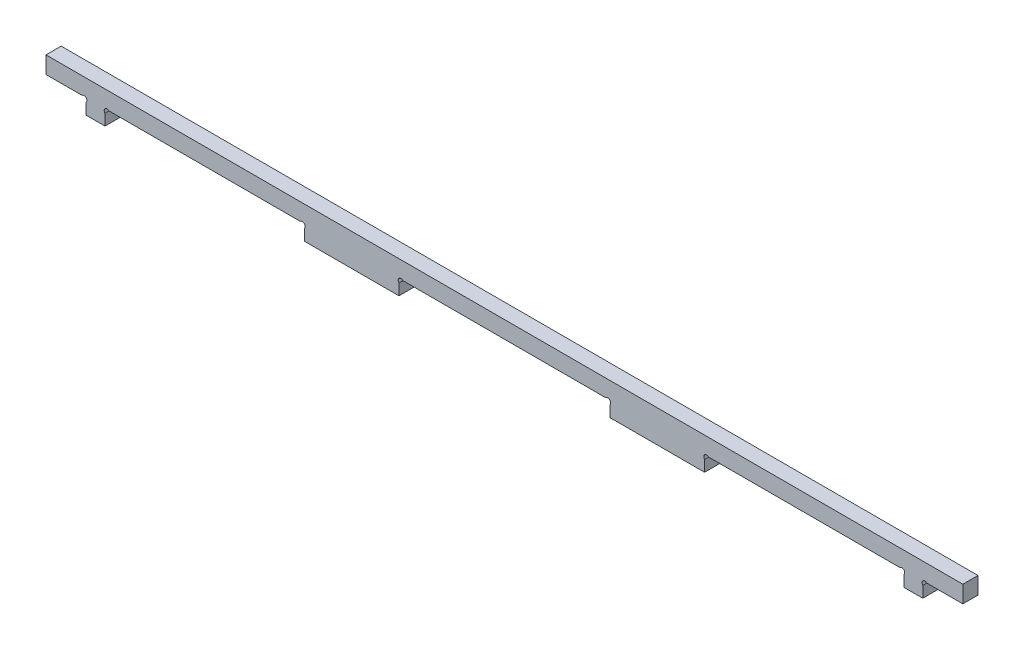
ISO-10303-21;
HEADER;
FILE_DESCRIPTION(('STEP AP214'),'2;1');
FILE_NAME('part.step','',(''),(''),'','','');
FILE_SCHEMA(('AUTOMOTIVE_DESIGN { 1 0 10303 214 1 1 1 1 }'));
ENDSEC;
DATA;
#1=APPLICATION_CONTEXT('core data for automotive mechanical design processes');
#2=APPLICATION_PROTOCOL_DEFINITION('international standard','automotive_design',2000,#1);
#3=PRODUCT_CONTEXT('',#1,'mechanical');
#4=PRODUCT('Part','Part','',(#3));
#5=PRODUCT_RELATED_PRODUCT_CATEGORY('part','',(#4));
#6=PRODUCT_DEFINITION_FORMATION('','',#4);
#7=PRODUCT_DEFINITION_CONTEXT('part definition',#1,'design');
#8=PRODUCT_DEFINITION('design','',#6,#7);
#9=PRODUCT_DEFINITION_SHAPE('','',#8);
#10=(LENGTH_UNIT() NAMED_UNIT(*) SI_UNIT(.MILLI.,.METRE.));
#11=(NAMED_UNIT(*) PLANE_ANGLE_UNIT() SI_UNIT($,.RADIAN.));
#12=(NAMED_UNIT(*) SI_UNIT($,.STERADIAN.) SOLID_ANGLE_UNIT());
#13=UNCERTAINTY_MEASURE_WITH_UNIT(LENGTH_MEASURE(1.E-05),#10,'distance_accuracy_value','');
#14=(GEOMETRIC_REPRESENTATION_CONTEXT(3) GLOBAL_UNCERTAINTY_ASSIGNED_CONTEXT((#13)) GLOBAL_UNIT_ASSIGNED_CONTEXT((#10,
#11,#12)) REPRESENTATION_CONTEXT('',''));
#15=CARTESIAN_POINT('',(0.,0.,0.));
#16=DIRECTION('',(0.,0.,1.));
#17=DIRECTION('',(1.,0.,0.));
#18=AXIS2_PLACEMENT_3D('',#15,#16,#17);
#19=CARTESIAN_POINT('',(-233.999999999997,77.5822204720186,8.));
#20=DIRECTION('',(1.,0.,0.));
#21=DIRECTION('',(0.,0.,-1.));
#22=AXIS2_PLACEMENT_3D('',#19,#20,#21);
#23=PLANE('',#22);
#24=DIRECTION('',(0.,-1.,0.));
#25=VECTOR('',#24,1.);
#26=CARTESIAN_POINT('',(-233.999999999997,77.5822204720186,0.));
#27=LINE('',#26,#25);
#28=CARTESIAN_POINT('',(-233.999999999997,77.5822204720186,0.));
#29=VERTEX_POINT('',#28);
#30=CARTESIAN_POINT('',(-233.999999999997,68.5822204720186,0.));
#31=VERTEX_POINT('',#30);
#32=EDGE_CURVE('E248',#29,#31,#27,.T.);
#33=ORIENTED_EDGE('',*,*,#32,.T.);
#34=DIRECTION('',(0.,0.,-1.));
#35=VECTOR('',#34,1.);
#36=CARTESIAN_POINT('',(-233.999999999997,68.5822204720186,8.));
#37=LINE('',#36,#35);
#38=CARTESIAN_POINT('',(-233.999999999997,68.5822204720186,8.));
#39=VERTEX_POINT('',#38);
#40=EDGE_CURVE('E11',#39,#31,#37,.T.);
#41=ORIENTED_EDGE('',*,*,#40,.F.);
#42=DIRECTION('',(0.,-1.,0.));
#43=VECTOR('',#42,1.);
#44=CARTESIAN_POINT('',(-233.999999999997,77.5822204720186,8.));
#45=LINE('',#44,#43);
#46=CARTESIAN_POINT('',(-233.999999999997,77.5822204720186,8.));
#47=VERTEX_POINT('',#46);
#48=EDGE_CURVE('E302',#47,#39,#45,.T.);
#49=ORIENTED_EDGE('',*,*,#48,.F.);
#50=DIRECTION('',(0.,0.,-1.));
#51=VECTOR('',#50,1.);
#52=CARTESIAN_POINT('',(-233.999999999997,77.5822204720186,8.));
#53=LINE('',#52,#51);
#54=EDGE_CURVE('E244',#47,#29,#53,.T.);
#55=ORIENTED_EDGE('',*,*,#54,.T.);
#56=EDGE_LOOP('',(#33,#41,#49,#55));
#57=FACE_BOUND('',#56,.T.);
#58=ADVANCED_FACE('F32',(#57),#23,.F.);
#59=CARTESIAN_POINT('',(-233.999999999997,68.5822204720186,8.));
#60=DIRECTION('',(0.,1.,0.));
#61=DIRECTION('',(-1.,0.,0.));
#62=AXIS2_PLACEMENT_3D('',#59,#60,#61);
#63=PLANE('',#62);
#64=DIRECTION('',(1.,0.,0.));
#65=VECTOR('',#64,1.);
#66=CARTESIAN_POINT('',(-233.999999999997,68.5822204720186,0.));
#67=LINE('',#66,#65);
#68=CARTESIAN_POINT('',(-214.972064577997,68.5822204720186,0.));
#69=VERTEX_POINT('',#68);
#70=EDGE_CURVE('E251',#31,#69,#67,.T.);
#71=ORIENTED_EDGE('',*,*,#70,.T.);
#72=DIRECTION('',(0.,0.,-1.));
#73=VECTOR('',#72,1.);
#74=CARTESIAN_POINT('',(-214.972064577997,68.5822204720186,8.));
#75=LINE('',#74,#73);
#76=CARTESIAN_POINT('',(-214.972064577997,68.5822204720186,8.));
#77=VERTEX_POINT('',#76);
#78=EDGE_CURVE('E40',#77,#69,#75,.T.);
#79=ORIENTED_EDGE('',*,*,#78,.F.);
#80=DIRECTION('',(1.,0.,0.));
#81=VECTOR('',#80,1.);
#82=CARTESIAN_POINT('',(-233.999999999997,68.5822204720186,8.));
#83=LINE('',#82,#81);
#84=EDGE_CURVE('E151',#39,#77,#83,.T.);
#85=ORIENTED_EDGE('',*,*,#84,.F.);
#86=ORIENTED_EDGE('',*,*,#40,.T.);
#87=EDGE_LOOP('',(#71,#79,#85,#86));
#88=FACE_BOUND('',#87,.T.);
#89=ADVANCED_FACE('F460',(#88),#63,.F.);
#90=CARTESIAN_POINT('',(-213.911404406218,67.5215603002388,8.));
#91=DIRECTION('',(0.,0.,-1.));
#92=DIRECTION('',(-1.,0.,0.));
#93=AXIS2_PLACEMENT_3D('',#90,#91,#92);
#94=CYLINDRICAL_SURFACE('',#93,1.5);
#95=CARTESIAN_POINT('',(-213.911404406218,67.5215603002388,0.));
#96=DIRECTION('',(0.,0.,-1.));
#97=DIRECTION('',(1.,0.,0.));
#98=AXIS2_PLACEMENT_3D('',#95,#96,#97);
#99=CIRCLE('',#98,1.5);
#100=CARTESIAN_POINT('',(-212.850744234438,66.460900128459,0.));
#101=VERTEX_POINT('',#100);
#102=EDGE_CURVE('E253',#69,#101,#99,.T.);
#103=ORIENTED_EDGE('',*,*,#102,.T.);
#104=DIRECTION('',(0.,0.,-1.));
#105=VECTOR('',#104,1.);
#106=CARTESIAN_POINT('',(-212.850744234438,66.460900128459,8.));
#107=LINE('',#106,#105);
#108=CARTESIAN_POINT('',(-212.850744234438,66.460900128459,8.));
#109=VERTEX_POINT('',#108);
#110=EDGE_CURVE('E369',#109,#101,#107,.T.);
#111=ORIENTED_EDGE('',*,*,#110,.F.);
#112=CARTESIAN_POINT('',(-213.911404406218,67.5215603002388,8.));
#113=DIRECTION('',(0.,0.,-1.));
#114=DIRECTION('',(1.,0.,0.));
#115=AXIS2_PLACEMENT_3D('',#112,#113,#114);
#116=CIRCLE('',#115,1.5);
#117=EDGE_CURVE('E377',#77,#109,#116,.T.);
#118=ORIENTED_EDGE('',*,*,#117,.F.);
#119=ORIENTED_EDGE('',*,*,#78,.T.);
#120=EDGE_LOOP('',(#103,#111,#118,#119));
#121=FACE_BOUND('',#120,.T.);
#122=ADVANCED_FACE('F375',(#121),#94,.F.);
#123=CARTESIAN_POINT('',(-212.850744234438,66.460900128459,8.));
#124=DIRECTION('',(1.,0.,0.));
#125=DIRECTION('',(0.,1.,0.));
#126=AXIS2_PLACEMENT_3D('',#123,#124,#125);
#127=PLANE('',#126);
#128=DIRECTION('',(0.,-1.,0.));
#129=VECTOR('',#128,1.);
#130=CARTESIAN_POINT('',(-212.850744234438,66.460900128459,0.));
#131=LINE('',#130,#129);
#132=CARTESIAN_POINT('',(-212.850744234438,60.5822204720186,0.));
#133=VERTEX_POINT('',#132);
#134=EDGE_CURVE('E255',#101,#133,#131,.T.);
#135=ORIENTED_EDGE('',*,*,#134,.T.);
#136=DIRECTION('',(0.,0.,-1.));
#137=VECTOR('',#136,1.);
#138=CARTESIAN_POINT('',(-212.850744234438,60.5822204720186,8.));
#139=LINE('',#138,#137);
#140=CARTESIAN_POINT('',(-212.850744234438,60.5822204720186,8.));
#141=VERTEX_POINT('',#140);
#142=EDGE_CURVE('E366',#141,#133,#139,.T.);
#143=ORIENTED_EDGE('',*,*,#142,.F.);
#144=DIRECTION('',(0.,-1.,0.));
#145=VECTOR('',#144,1.);
#146=CARTESIAN_POINT('',(-212.850744234438,66.460900128459,8.));
#147=LINE('',#146,#145);
#148=EDGE_CURVE('E395',#109,#141,#147,.T.);
#149=ORIENTED_EDGE('',*,*,#148,.F.);
#150=ORIENTED_EDGE('',*,*,#110,.T.);
#151=EDGE_LOOP('',(#135,#143,#149,#150));
#152=FACE_BOUND('',#151,.T.);
#153=ADVANCED_FACE('F386',(#152),#127,.F.);
#154=CARTESIAN_POINT('',(-212.850744234438,60.5822204720186,8.));
#155=DIRECTION('',(0.,1.,0.));
#156=DIRECTION('',(0.,0.,1.));
#157=AXIS2_PLACEMENT_3D('',#154,#155,#156);
#158=PLANE('',#157);
#159=DIRECTION('',(1.,0.,0.));
#160=VECTOR('',#159,1.);
#161=CARTESIAN_POINT('',(-212.850744234438,60.5822204720186,0.));
#162=LINE('',#161,#160);
#163=CARTESIAN_POINT('',(-202.850744234438,60.5822204720186,0.));
#164=VERTEX_POINT('',#163);
#165=EDGE_CURVE('E257',#133,#164,#162,.T.);
#166=ORIENTED_EDGE('',*,*,#165,.T.);
#167=DIRECTION('',(0.,0.,-1.));
#168=VECTOR('',#167,1.);
#169=CARTESIAN_POINT('',(-202.850744234438,60.5822204720186,8.));
#170=LINE('',#169,#168);
#171=CARTESIAN_POINT('',(-202.850744234438,60.5822204720186,8.));
#172=VERTEX_POINT('',#171);
#173=EDGE_CURVE('E363',#172,#164,#170,.T.);
#174=ORIENTED_EDGE('',*,*,#173,.F.);
#175=DIRECTION('',(1.,0.,0.));
#176=VECTOR('',#175,1.);
#177=CARTESIAN_POINT('',(-212.850744234438,60.5822204720186,8.));
#178=LINE('',#177,#176);
#179=EDGE_CURVE('E392',#141,#172,#178,.T.);
#180=ORIENTED_EDGE('',*,*,#179,.F.);
#181=ORIENTED_EDGE('',*,*,#142,.T.);
#182=EDGE_LOOP('',(#166,#174,#180,#181));
#183=FACE_BOUND('',#182,.T.);
#184=ADVANCED_FACE('F390',(#183),#158,.F.);
#185=CARTESIAN_POINT('',(-202.850744234438,60.5822204720186,8.));
#186=DIRECTION('',(-1.,0.,0.));
#187=DIRECTION('',(0.,-1.,0.));
#188=AXIS2_PLACEMENT_3D('',#185,#186,#187);
#189=PLANE('',#188);
#190=DIRECTION('',(0.,1.,0.));
#191=VECTOR('',#190,1.);
#192=CARTESIAN_POINT('',(-202.850744234438,60.5822204720186,0.));
#193=LINE('',#192,#191);
#194=CARTESIAN_POINT('',(-202.850744234438,66.460900128459,0.));
#195=VERTEX_POINT('',#194);
#196=EDGE_CURVE('E259',#164,#195,#193,.T.);
#197=ORIENTED_EDGE('',*,*,#196,.T.);
#198=DIRECTION('',(0.,0.,-1.));
#199=VECTOR('',#198,1.);
#200=CARTESIAN_POINT('',(-202.850744234438,66.460900128459,8.));
#201=LINE('',#200,#199);
#202=CARTESIAN_POINT('',(-202.850744234438,66.460900128459,8.));
#203=VERTEX_POINT('',#202);
#204=EDGE_CURVE('E360',#203,#195,#201,.T.);
#205=ORIENTED_EDGE('',*,*,#204,.F.);
#206=DIRECTION('',(0.,1.,0.));
#207=VECTOR('',#206,1.);
#208=CARTESIAN_POINT('',(-202.850744234438,60.5822204720186,8.));
#209=LINE('',#208,#207);
#210=EDGE_CURVE('E394',#172,#203,#209,.T.);
#211=ORIENTED_EDGE('',*,*,#210,.F.);
#212=ORIENTED_EDGE('',*,*,#173,.T.);
#213=EDGE_LOOP('',(#197,#205,#211,#212));
#214=FACE_BOUND('',#213,.T.);
#215=ADVANCED_FACE('F473',(#214),#189,.F.);
#216=CARTESIAN_POINT('',(-201.790084062658,67.5215603002388,8.));
#217=DIRECTION('',(0.,0.,-1.));
#218=DIRECTION('',(-1.,0.,0.));
#219=AXIS2_PLACEMENT_3D('',#216,#217,#218);
#220=CYLINDRICAL_SURFACE('',#219,1.5);
#221=CARTESIAN_POINT('',(-201.790084062658,67.5215603002388,0.));
#222=DIRECTION('',(0.,0.,-1.));
#223=DIRECTION('',(1.,0.,0.));
#224=AXIS2_PLACEMENT_3D('',#221,#222,#223);
#225=CIRCLE('',#224,1.5);
#226=CARTESIAN_POINT('',(-200.729423890878,68.5822204720186,0.));
#227=VERTEX_POINT('',#226);
#228=EDGE_CURVE('E261',#195,#227,#225,.T.);
#229=ORIENTED_EDGE('',*,*,#228,.T.);
#230=DIRECTION('',(0.,0.,-1.));
#231=VECTOR('',#230,1.);
#232=CARTESIAN_POINT('',(-200.729423890878,68.5822204720186,8.));
#233=LINE('',#232,#231);
#234=CARTESIAN_POINT('',(-200.729423890878,68.5822204720186,8.));
#235=VERTEX_POINT('',#234);
#236=EDGE_CURVE('E357',#235,#227,#233,.T.);
#237=ORIENTED_EDGE('',*,*,#236,.F.);
#238=CARTESIAN_POINT('',(-201.790084062658,67.5215603002388,8.));
#239=DIRECTION('',(0.,0.,-1.));
#240=DIRECTION('',(1.,0.,0.));
#241=AXIS2_PLACEMENT_3D('',#238,#239,#240);
#242=CIRCLE('',#241,1.5);
#243=EDGE_CURVE('E397',#203,#235,#242,.T.);
#244=ORIENTED_EDGE('',*,*,#243,.F.);
#245=ORIENTED_EDGE('',*,*,#204,.T.);
#246=EDGE_LOOP('',(#229,#237,#244,#245));
#247=FACE_BOUND('',#246,.T.);
#248=ADVANCED_FACE('F476',(#247),#220,.F.);
#249=CARTESIAN_POINT('',(-200.729423890878,68.5822204720186,8.));
#250=DIRECTION('',(0.,1.,0.));
#251=DIRECTION('',(0.,0.,1.));
#252=AXIS2_PLACEMENT_3D('',#249,#250,#251);
#253=PLANE('',#252);
#254=DIRECTION('',(1.,0.,0.));
#255=VECTOR('',#254,1.);
#256=CARTESIAN_POINT('',(-200.729423890878,68.5822204720186,0.));
#257=LINE('',#256,#255);
#258=CARTESIAN_POINT('',(-99.7875172457823,68.5822204720186,0.));
#259=VERTEX_POINT('',#258);
#260=EDGE_CURVE('E263',#227,#259,#257,.T.);
#261=ORIENTED_EDGE('',*,*,#260,.T.);
#262=DIRECTION('',(0.,0.,-1.));
#263=VECTOR('',#262,1.);
#264=CARTESIAN_POINT('',(-99.7875172457823,68.5822204720186,8.));
#265=LINE('',#264,#263);
#266=CARTESIAN_POINT('',(-99.7875172457823,68.5822204720186,8.));
#267=VERTEX_POINT('',#266);
#268=EDGE_CURVE('E354',#267,#259,#265,.T.);
#269=ORIENTED_EDGE('',*,*,#268,.F.);
#270=DIRECTION('',(1.,0.,0.));
#271=VECTOR('',#270,1.);
#272=CARTESIAN_POINT('',(-200.729423890878,68.5822204720186,8.));
#273=LINE('',#272,#271);
#274=EDGE_CURVE('E403',#235,#267,#273,.T.);
#275=ORIENTED_EDGE('',*,*,#274,.F.);
#276=ORIENTED_EDGE('',*,*,#236,.T.);
#277=EDGE_LOOP('',(#261,#269,#275,#276));
#278=FACE_BOUND('',#277,.T.);
#279=ADVANCED_FACE('F480',(#278),#253,.F.);
#280=CARTESIAN_POINT('',(-98.7268570740025,67.5215603002388,8.));
#281=DIRECTION('',(0.,0.,-1.));
#282=DIRECTION('',(-1.,0.,0.));
#283=AXIS2_PLACEMENT_3D('',#280,#281,#282);
#284=CYLINDRICAL_SURFACE('',#283,1.49999999999996);
#285=CARTESIAN_POINT('',(-98.7268570740025,67.5215603002388,0.));
#286=DIRECTION('',(0.,0.,-1.));
#287=DIRECTION('',(1.,0.,0.));
#288=AXIS2_PLACEMENT_3D('',#285,#286,#287);
#289=CIRCLE('',#288,1.49999999999996);
#290=CARTESIAN_POINT('',(-97.6661969022227,66.460900128459,0.));
#291=VERTEX_POINT('',#290);
#292=EDGE_CURVE('E265',#259,#291,#289,.T.);
#293=ORIENTED_EDGE('',*,*,#292,.T.);
#294=DIRECTION('',(0.,0.,-1.));
#295=VECTOR('',#294,1.);
#296=CARTESIAN_POINT('',(-97.6661969022227,66.460900128459,8.));
#297=LINE('',#296,#295);
#298=CARTESIAN_POINT('',(-97.6661969022227,66.460900128459,8.));
#299=VERTEX_POINT('',#298);
#300=EDGE_CURVE('E351',#299,#291,#297,.T.);
#301=ORIENTED_EDGE('',*,*,#300,.F.);
#302=CARTESIAN_POINT('',(-98.7268570740025,67.5215603002388,8.));
#303=DIRECTION('',(0.,0.,-1.));
#304=DIRECTION('',(1.,0.,0.));
#305=AXIS2_PLACEMENT_3D('',#302,#303,#304);
#306=CIRCLE('',#305,1.49999999999996);
#307=EDGE_CURVE('E405',#267,#299,#306,.T.);
#308=ORIENTED_EDGE('',*,*,#307,.F.);
#309=ORIENTED_EDGE('',*,*,#268,.T.);
#310=EDGE_LOOP('',(#293,#301,#308,#309));
#311=FACE_BOUND('',#310,.T.);
#312=ADVANCED_FACE('F484',(#311),#284,.F.);
#313=CARTESIAN_POINT('',(-97.6661969022227,66.460900128459,8.));
#314=DIRECTION('',(1.,0.,0.));
#315=DIRECTION('',(0.,0.,-1.));
#316=AXIS2_PLACEMENT_3D('',#313,#314,#315);
#317=PLANE('',#316);
#318=DIRECTION('',(0.,-1.,0.));
#319=VECTOR('',#318,1.);
#320=CARTESIAN_POINT('',(-97.6661969022227,66.460900128459,0.));
#321=LINE('',#320,#319);
#322=CARTESIAN_POINT('',(-97.6661969022227,60.5822204720186,0.));
#323=VERTEX_POINT('',#322);
#324=EDGE_CURVE('E267',#291,#323,#321,.T.);
#325=ORIENTED_EDGE('',*,*,#324,.T.);
#326=DIRECTION('',(0.,0.,-1.));
#327=VECTOR('',#326,1.);
#328=CARTESIAN_POINT('',(-97.6661969022227,60.5822204720186,8.));
#329=LINE('',#328,#327);
#330=CARTESIAN_POINT('',(-97.6661969022227,60.5822204720186,8.));
#331=VERTEX_POINT('',#330);
#332=EDGE_CURVE('E348',#331,#323,#329,.T.);
#333=ORIENTED_EDGE('',*,*,#332,.F.);
#334=DIRECTION('',(0.,-1.,0.));
#335=VECTOR('',#334,1.);
#336=CARTESIAN_POINT('',(-97.6661969022227,66.460900128459,8.));
#337=LINE('',#336,#335);
#338=EDGE_CURVE('E407',#299,#331,#337,.T.);
#339=ORIENTED_EDGE('',*,*,#338,.F.);
#340=ORIENTED_EDGE('',*,*,#300,.T.);
#341=EDGE_LOOP('',(#325,#333,#339,#340));
#342=FACE_BOUND('',#341,.T.);
#343=ADVANCED_FACE('F488',(#342),#317,.F.);
#344=CARTESIAN_POINT('',(-97.6661969022227,60.5822204720186,8.));
#345=DIRECTION('',(0.,1.,0.));
#346=DIRECTION('',(0.,0.,1.));
#347=AXIS2_PLACEMENT_3D('',#344,#345,#346);
#348=PLANE('',#347);
#349=DIRECTION('',(1.,0.,0.));
#350=VECTOR('',#349,1.);
#351=CARTESIAN_POINT('',(-97.6661969022227,60.5822204720186,0.));
#352=LINE('',#351,#350);
#353=CARTESIAN_POINT('',(-47.6661969022227,60.5822204720186,0.));
#354=VERTEX_POINT('',#353);
#355=EDGE_CURVE('E269',#323,#354,#352,.T.);
#356=ORIENTED_EDGE('',*,*,#355,.T.);
#357=DIRECTION('',(0.,0.,-1.));
#358=VECTOR('',#357,1.);
#359=CARTESIAN_POINT('',(-47.6661969022227,60.5822204720186,8.));
#360=LINE('',#359,#358);
#361=CARTESIAN_POINT('',(-47.6661969022227,60.5822204720186,8.));
#362=VERTEX_POINT('',#361);
#363=EDGE_CURVE('E345',#362,#354,#360,.T.);
#364=ORIENTED_EDGE('',*,*,#363,.F.);
#365=DIRECTION('',(1.,0.,0.));
#366=VECTOR('',#365,1.);
#367=CARTESIAN_POINT('',(-97.6661969022227,60.5822204720186,8.));
#368=LINE('',#367,#366);
#369=EDGE_CURVE('E409',#331,#362,#368,.T.);
#370=ORIENTED_EDGE('',*,*,#369,.F.);
#371=ORIENTED_EDGE('',*,*,#332,.T.);
#372=EDGE_LOOP('',(#356,#364,#370,#371));
#373=FACE_BOUND('',#372,.T.);
#374=ADVANCED_FACE('F492',(#373),#348,.F.);
#375=CARTESIAN_POINT('',(-47.6661969022227,60.5822204720186,8.));
#376=DIRECTION('',(-1.,0.,0.));
#377=DIRECTION('',(0.,0.,1.));
#378=AXIS2_PLACEMENT_3D('',#375,#376,#377);
#379=PLANE('',#378);
#380=DIRECTION('',(0.,1.,0.));
#381=VECTOR('',#380,1.);
#382=CARTESIAN_POINT('',(-47.6661969022227,60.5822204720186,0.));
#383=LINE('',#382,#381);
#384=CARTESIAN_POINT('',(-47.6661969022227,66.460900128459,0.));
#385=VERTEX_POINT('',#384);
#386=EDGE_CURVE('E271',#354,#385,#383,.T.);
#387=ORIENTED_EDGE('',*,*,#386,.T.);
#388=DIRECTION('',(0.,0.,-1.));
#389=VECTOR('',#388,1.);
#390=CARTESIAN_POINT('',(-47.6661969022227,66.460900128459,8.));
#391=LINE('',#390,#389);
#392=CARTESIAN_POINT('',(-47.6661969022227,66.460900128459,8.));
#393=VERTEX_POINT('',#392);
#394=EDGE_CURVE('E342',#393,#385,#391,.T.);
#395=ORIENTED_EDGE('',*,*,#394,.F.);
#396=DIRECTION('',(0.,1.,0.));
#397=VECTOR('',#396,1.);
#398=CARTESIAN_POINT('',(-47.6661969022227,60.5822204720186,8.));
#399=LINE('',#398,#397);
#400=EDGE_CURVE('E411',#362,#393,#399,.T.);
#401=ORIENTED_EDGE('',*,*,#400,.F.);
#402=ORIENTED_EDGE('',*,*,#363,.T.);
#403=EDGE_LOOP('',(#387,#395,#401,#402));
#404=FACE_BOUND('',#403,.T.);
#405=ADVANCED_FACE('F496',(#404),#379,.F.);
#406=CARTESIAN_POINT('',(-46.6055367304429,67.5215603002388,8.));
#407=DIRECTION('',(0.,0.,-1.));
#408=DIRECTION('',(-1.,0.,0.));
#409=AXIS2_PLACEMENT_3D('',#406,#407,#408);
#410=CYLINDRICAL_SURFACE('',#409,1.5);
#411=CARTESIAN_POINT('',(-46.6055367304429,67.5215603002388,0.));
#412=DIRECTION('',(0.,0.,-1.));
#413=DIRECTION('',(1.,0.,0.));
#414=AXIS2_PLACEMENT_3D('',#411,#412,#413);
#415=CIRCLE('',#414,1.5);
#416=CARTESIAN_POINT('',(-45.544876558663,68.5822204720186,0.));
#417=VERTEX_POINT('',#416);
#418=EDGE_CURVE('E273',#385,#417,#415,.T.);
#419=ORIENTED_EDGE('',*,*,#418,.T.);
#420=DIRECTION('',(0.,0.,-1.));
#421=VECTOR('',#420,1.);
#422=CARTESIAN_POINT('',(-45.544876558663,68.5822204720186,8.));
#423=LINE('',#422,#421);
#424=CARTESIAN_POINT('',(-45.544876558663,68.5822204720186,8.));
#425=VERTEX_POINT('',#424);
#426=EDGE_CURVE('E339',#425,#417,#423,.T.);
#427=ORIENTED_EDGE('',*,*,#426,.F.);
#428=CARTESIAN_POINT('',(-46.6055367304429,67.5215603002388,8.));
#429=DIRECTION('',(0.,0.,-1.));
#430=DIRECTION('',(1.,0.,0.));
#431=AXIS2_PLACEMENT_3D('',#428,#429,#430);
#432=CIRCLE('',#431,1.5);
#433=EDGE_CURVE('E413',#393,#425,#432,.T.);
#434=ORIENTED_EDGE('',*,*,#433,.F.);
#435=ORIENTED_EDGE('',*,*,#394,.T.);
#436=EDGE_LOOP('',(#419,#427,#434,#435));
#437=FACE_BOUND('',#436,.T.);
#438=ADVANCED_FACE('F500',(#437),#410,.F.);
#439=CARTESIAN_POINT('',(-45.544876558663,68.5822204720186,8.));
#440=DIRECTION('',(0.,1.,0.));
#441=DIRECTION('',(0.,0.,1.));
#442=AXIS2_PLACEMENT_3D('',#439,#440,#441);
#443=PLANE('',#442);
#444=DIRECTION('',(1.,0.,0.));
#445=VECTOR('',#444,1.);
#446=CARTESIAN_POINT('',(-45.544876558663,68.5822204720186,0.));
#447=LINE('',#446,#445);
#448=CARTESIAN_POINT('',(61.5448765586698,68.5822204720186,0.));
#449=VERTEX_POINT('',#448);
#450=EDGE_CURVE('E275',#417,#449,#447,.T.);
#451=ORIENTED_EDGE('',*,*,#450,.T.);
#452=DIRECTION('',(0.,0.,-1.));
#453=VECTOR('',#452,1.);
#454=CARTESIAN_POINT('',(61.5448765586698,68.5822204720186,8.));
#455=LINE('',#454,#453);
#456=CARTESIAN_POINT('',(61.5448765586698,68.5822204720186,8.));
#457=VERTEX_POINT('',#456);
#458=EDGE_CURVE('E336',#457,#449,#455,.T.);
#459=ORIENTED_EDGE('',*,*,#458,.F.);
#460=DIRECTION('',(1.,0.,0.));
#461=VECTOR('',#460,1.);
#462=CARTESIAN_POINT('',(-45.544876558663,68.5822204720186,8.));
#463=LINE('',#462,#461);
#464=EDGE_CURVE('E415',#425,#457,#463,.T.);
#465=ORIENTED_EDGE('',*,*,#464,.F.);
#466=ORIENTED_EDGE('',*,*,#426,.T.);
#467=EDGE_LOOP('',(#451,#459,#465,#466));
#468=FACE_BOUND('',#467,.T.);
#469=ADVANCED_FACE('F504',(#468),#443,.F.);
#470=CARTESIAN_POINT('',(62.6055367304497,67.5215603002388,8.));
#471=DIRECTION('',(0.,0.,-1.));
#472=DIRECTION('',(-1.,0.,0.));
#473=AXIS2_PLACEMENT_3D('',#470,#471,#472);
#474=CYLINDRICAL_SURFACE('',#473,1.5);
#475=CARTESIAN_POINT('',(62.6055367304497,67.5215603002388,0.));
#476=DIRECTION('',(0.,0.,-1.));
#477=DIRECTION('',(-1.,0.,0.));
#478=AXIS2_PLACEMENT_3D('',#475,#476,#477);
#479=CIRCLE('',#478,1.5);
#480=CARTESIAN_POINT('',(63.6661969022295,66.460900128459,0.));
#481=VERTEX_POINT('',#480);
#482=EDGE_CURVE('E277',#449,#481,#479,.T.);
#483=ORIENTED_EDGE('',*,*,#482,.T.);
#484=DIRECTION('',(0.,0.,-1.));
#485=VECTOR('',#484,1.);
#486=CARTESIAN_POINT('',(63.6661969022295,66.460900128459,8.));
#487=LINE('',#486,#485);
#488=CARTESIAN_POINT('',(63.6661969022295,66.460900128459,8.));
#489=VERTEX_POINT('',#488);
#490=EDGE_CURVE('E333',#489,#481,#487,.T.);
#491=ORIENTED_EDGE('',*,*,#490,.F.);
#492=CARTESIAN_POINT('',(62.6055367304497,67.5215603002388,8.));
#493=DIRECTION('',(0.,0.,-1.));
#494=DIRECTION('',(-1.,0.,0.));
#495=AXIS2_PLACEMENT_3D('',#492,#493,#494);
#496=CIRCLE('',#495,1.5);
#497=EDGE_CURVE('E417',#457,#489,#496,.T.);
#498=ORIENTED_EDGE('',*,*,#497,.F.);
#499=ORIENTED_EDGE('',*,*,#458,.T.);
#500=EDGE_LOOP('',(#483,#491,#498,#499));
#501=FACE_BOUND('',#500,.T.);
#502=ADVANCED_FACE('F508',(#501),#474,.F.);
#503=CARTESIAN_POINT('',(63.6661969022296,60.5822204720186,8.));
#504=DIRECTION('',(1.,0.,0.));
#505=DIRECTION('',(0.,1.,0.));
#506=AXIS2_PLACEMENT_3D('',#503,#504,#505);
#507=PLANE('',#506);
#508=DIRECTION('',(0.,-1.,0.));
#509=VECTOR('',#508,1.);
#510=CARTESIAN_POINT('',(63.6661969022296,60.5822204720186,0.));
#511=LINE('',#510,#509);
#512=CARTESIAN_POINT('',(63.6661969022296,60.5822204720186,0.));
#513=VERTEX_POINT('',#512);
#514=EDGE_CURVE('E279',#481,#513,#511,.T.);
#515=ORIENTED_EDGE('',*,*,#514,.T.);
#516=DIRECTION('',(0.,0.,-1.));
#517=VECTOR('',#516,1.);
#518=CARTESIAN_POINT('',(63.6661969022296,60.5822204720186,8.));
#519=LINE('',#518,#517);
#520=CARTESIAN_POINT('',(63.6661969022296,60.5822204720186,8.));
#521=VERTEX_POINT('',#520);
#522=EDGE_CURVE('E330',#521,#513,#519,.T.);
#523=ORIENTED_EDGE('',*,*,#522,.F.);
#524=DIRECTION('',(0.,-1.,0.));
#525=VECTOR('',#524,1.);
#526=CARTESIAN_POINT('',(63.6661969022296,60.5822204720186,8.));
#527=LINE('',#526,#525);
#528=EDGE_CURVE('E419',#489,#521,#527,.T.);
#529=ORIENTED_EDGE('',*,*,#528,.F.);
#530=ORIENTED_EDGE('',*,*,#490,.T.);
#531=EDGE_LOOP('',(#515,#523,#529,#530));
#532=FACE_BOUND('',#531,.T.);
#533=ADVANCED_FACE('F512',(#532),#507,.F.);
#534=CARTESIAN_POINT('',(113.66619690223,60.5822204720186,8.));
#535=DIRECTION('',(0.,1.,0.));
#536=DIRECTION('',(0.,0.,1.));
#537=AXIS2_PLACEMENT_3D('',#534,#535,#536);
#538=PLANE('',#537);
#539=DIRECTION('',(1.,0.,0.));
#540=VECTOR('',#539,1.);
#541=CARTESIAN_POINT('',(113.66619690223,60.5822204720186,0.));
#542=LINE('',#541,#540);
#543=CARTESIAN_POINT('',(113.66619690223,60.5822204720186,0.));
#544=VERTEX_POINT('',#543);
#545=EDGE_CURVE('E281',#513,#544,#542,.T.);
#546=ORIENTED_EDGE('',*,*,#545,.T.);
#547=DIRECTION('',(0.,0.,-1.));
#548=VECTOR('',#547,1.);
#549=CARTESIAN_POINT('',(113.66619690223,60.5822204720186,8.));
#550=LINE('',#549,#548);
#551=CARTESIAN_POINT('',(113.66619690223,60.5822204720186,8.));
#552=VERTEX_POINT('',#551);
#553=EDGE_CURVE('E327',#552,#544,#550,.T.);
#554=ORIENTED_EDGE('',*,*,#553,.F.);
#555=DIRECTION('',(1.,0.,0.));
#556=VECTOR('',#555,1.);
#557=CARTESIAN_POINT('',(113.66619690223,60.5822204720186,8.));
#558=LINE('',#557,#556);
#559=EDGE_CURVE('E421',#521,#552,#558,.T.);
#560=ORIENTED_EDGE('',*,*,#559,.F.);
#561=ORIENTED_EDGE('',*,*,#522,.T.);
#562=EDGE_LOOP('',(#546,#554,#560,#561));
#563=FACE_BOUND('',#562,.T.);
#564=ADVANCED_FACE('F516',(#563),#538,.F.);
#565=CARTESIAN_POINT('',(113.666196902229,66.460900128459,8.));
#566=DIRECTION('',(-1.,0.,0.));
#567=DIRECTION('',(0.,-1.,0.));
#568=AXIS2_PLACEMENT_3D('',#565,#566,#567);
#569=PLANE('',#568);
#570=DIRECTION('',(0.,1.,0.));
#571=VECTOR('',#570,1.);
#572=CARTESIAN_POINT('',(113.666196902229,66.460900128459,0.));
#573=LINE('',#572,#571);
#574=CARTESIAN_POINT('',(113.666196902229,66.460900128459,0.));
#575=VERTEX_POINT('',#574);
#576=EDGE_CURVE('E283',#544,#575,#573,.T.);
#577=ORIENTED_EDGE('',*,*,#576,.T.);
#578=DIRECTION('',(0.,0.,-1.));
#579=VECTOR('',#578,1.);
#580=CARTESIAN_POINT('',(113.666196902229,66.460900128459,8.));
#581=LINE('',#580,#579);
#582=CARTESIAN_POINT('',(113.666196902229,66.460900128459,8.));
#583=VERTEX_POINT('',#582);
#584=EDGE_CURVE('E324',#583,#575,#581,.T.);
#585=ORIENTED_EDGE('',*,*,#584,.F.);
#586=DIRECTION('',(0.,1.,0.));
#587=VECTOR('',#586,1.);
#588=CARTESIAN_POINT('',(113.666196902229,66.460900128459,8.));
#589=LINE('',#588,#587);
#590=EDGE_CURVE('E423',#552,#583,#589,.T.);
#591=ORIENTED_EDGE('',*,*,#590,.F.);
#592=ORIENTED_EDGE('',*,*,#553,.T.);
#593=EDGE_LOOP('',(#577,#585,#591,#592));
#594=FACE_BOUND('',#593,.T.);
#595=ADVANCED_FACE('F520',(#594),#569,.F.);
#596=CARTESIAN_POINT('',(114.726857074009,67.5215603002388,8.));
#597=DIRECTION('',(0.,0.,-1.));
#598=DIRECTION('',(-1.,0.,0.));
#599=AXIS2_PLACEMENT_3D('',#596,#597,#598);
#600=CYLINDRICAL_SURFACE('',#599,1.49999999999996);
#601=CARTESIAN_POINT('',(114.726857074009,67.5215603002388,0.));
#602=DIRECTION('',(0.,0.,-1.));
#603=DIRECTION('',(-1.,0.,0.));
#604=AXIS2_PLACEMENT_3D('',#601,#602,#603);
#605=CIRCLE('',#604,1.49999999999996);
#606=CARTESIAN_POINT('',(115.787517245789,68.5822204720186,0.));
#607=VERTEX_POINT('',#606);
#608=EDGE_CURVE('E285',#575,#607,#605,.T.);
#609=ORIENTED_EDGE('',*,*,#608,.T.);
#610=DIRECTION('',(0.,0.,-1.));
#611=VECTOR('',#610,1.);
#612=CARTESIAN_POINT('',(115.787517245789,68.5822204720186,8.));
#613=LINE('',#612,#611);
#614=CARTESIAN_POINT('',(115.787517245789,68.5822204720186,8.));
#615=VERTEX_POINT('',#614);
#616=EDGE_CURVE('E321',#615,#607,#613,.T.);
#617=ORIENTED_EDGE('',*,*,#616,.F.);
#618=CARTESIAN_POINT('',(114.726857074009,67.5215603002388,8.));
#619=DIRECTION('',(0.,0.,-1.));
#620=DIRECTION('',(-1.,0.,0.));
#621=AXIS2_PLACEMENT_3D('',#618,#619,#620);
#622=CIRCLE('',#621,1.49999999999996);
#623=EDGE_CURVE('E425',#583,#615,#622,.T.);
#624=ORIENTED_EDGE('',*,*,#623,.F.);
#625=ORIENTED_EDGE('',*,*,#584,.T.);
#626=EDGE_LOOP('',(#609,#617,#624,#625));
#627=FACE_BOUND('',#626,.T.);
#628=ADVANCED_FACE('F524',(#627),#600,.F.);
#629=CARTESIAN_POINT('',(115.787517245789,68.5822204720186,8.));
#630=DIRECTION('',(0.,1.,0.));
#631=DIRECTION('',(0.,0.,1.));
#632=AXIS2_PLACEMENT_3D('',#629,#630,#631);
#633=PLANE('',#632);
#634=DIRECTION('',(1.,0.,0.));
#635=VECTOR('',#634,1.);
#636=CARTESIAN_POINT('',(115.787517245789,68.5822204720186,0.));
#637=LINE('',#636,#635);
#638=CARTESIAN_POINT('',(216.729423890885,68.5822204720186,0.));
#639=VERTEX_POINT('',#638);
#640=EDGE_CURVE('E287',#607,#639,#637,.T.);
#641=ORIENTED_EDGE('',*,*,#640,.T.);
#642=DIRECTION('',(0.,0.,-1.));
#643=VECTOR('',#642,1.);
#644=CARTESIAN_POINT('',(216.729423890885,68.5822204720186,8.));
#645=LINE('',#644,#643);
#646=CARTESIAN_POINT('',(216.729423890885,68.5822204720186,8.));
#647=VERTEX_POINT('',#646);
#648=EDGE_CURVE('E318',#647,#639,#645,.T.);
#649=ORIENTED_EDGE('',*,*,#648,.F.);
#650=DIRECTION('',(1.,0.,0.));
#651=VECTOR('',#650,1.);
#652=CARTESIAN_POINT('',(115.787517245789,68.5822204720186,8.));
#653=LINE('',#652,#651);
#654=EDGE_CURVE('E427',#615,#647,#653,.T.);
#655=ORIENTED_EDGE('',*,*,#654,.F.);
#656=ORIENTED_EDGE('',*,*,#616,.T.);
#657=EDGE_LOOP('',(#641,#649,#655,#656));
#658=FACE_BOUND('',#657,.T.);
#659=ADVANCED_FACE('F528',(#658),#633,.F.);
#660=CARTESIAN_POINT('',(217.790084062665,67.5215603002388,8.));
#661=DIRECTION('',(0.,0.,-1.));
#662=DIRECTION('',(-1.,0.,0.));
#663=AXIS2_PLACEMENT_3D('',#660,#661,#662);
#664=CYLINDRICAL_SURFACE('',#663,1.5);
#665=CARTESIAN_POINT('',(217.790084062665,67.5215603002388,0.));
#666=DIRECTION('',(0.,0.,-1.));
#667=DIRECTION('',(-1.,0.,0.));
#668=AXIS2_PLACEMENT_3D('',#665,#666,#667);
#669=CIRCLE('',#668,1.5);
#670=CARTESIAN_POINT('',(218.850744234445,66.460900128459,0.));
#671=VERTEX_POINT('',#670);
#672=EDGE_CURVE('E289',#639,#671,#669,.T.);
#673=ORIENTED_EDGE('',*,*,#672,.T.);
#674=DIRECTION('',(0.,0.,-1.));
#675=VECTOR('',#674,1.);
#676=CARTESIAN_POINT('',(218.850744234445,66.460900128459,8.));
#677=LINE('',#676,#675);
#678=CARTESIAN_POINT('',(218.850744234445,66.460900128459,8.));
#679=VERTEX_POINT('',#678);
#680=EDGE_CURVE('E315',#679,#671,#677,.T.);
#681=ORIENTED_EDGE('',*,*,#680,.F.);
#682=CARTESIAN_POINT('',(217.790084062665,67.5215603002388,8.));
#683=DIRECTION('',(0.,0.,-1.));
#684=DIRECTION('',(-1.,0.,0.));
#685=AXIS2_PLACEMENT_3D('',#682,#683,#684);
#686=CIRCLE('',#685,1.5);
#687=EDGE_CURVE('E429',#647,#679,#686,.T.);
#688=ORIENTED_EDGE('',*,*,#687,.F.);
#689=ORIENTED_EDGE('',*,*,#648,.T.);
#690=EDGE_LOOP('',(#673,#681,#688,#689));
#691=FACE_BOUND('',#690,.T.);
#692=ADVANCED_FACE('F532',(#691),#664,.F.);
#693=CARTESIAN_POINT('',(218.850744234445,60.5822204720186,8.));
#694=DIRECTION('',(1.,0.,0.));
#695=DIRECTION('',(0.,1.,0.));
#696=AXIS2_PLACEMENT_3D('',#693,#694,#695);
#697=PLANE('',#696);
#698=DIRECTION('',(0.,-1.,0.));
#699=VECTOR('',#698,1.);
#700=CARTESIAN_POINT('',(218.850744234445,60.5822204720186,0.));
#701=LINE('',#700,#699);
#702=CARTESIAN_POINT('',(218.850744234445,60.5822204720186,0.));
#703=VERTEX_POINT('',#702);
#704=EDGE_CURVE('E291',#671,#703,#701,.T.);
#705=ORIENTED_EDGE('',*,*,#704,.T.);
#706=DIRECTION('',(0.,0.,-1.));
#707=VECTOR('',#706,1.);
#708=CARTESIAN_POINT('',(218.850744234445,60.5822204720186,8.));
#709=LINE('',#708,#707);
#710=CARTESIAN_POINT('',(218.850744234445,60.5822204720186,8.));
#711=VERTEX_POINT('',#710);
#712=EDGE_CURVE('E312',#711,#703,#709,.T.);
#713=ORIENTED_EDGE('',*,*,#712,.F.);
#714=DIRECTION('',(0.,-1.,0.));
#715=VECTOR('',#714,1.);
#716=CARTESIAN_POINT('',(218.850744234445,60.5822204720186,8.));
#717=LINE('',#716,#715);
#718=EDGE_CURVE('E431',#679,#711,#717,.T.);
#719=ORIENTED_EDGE('',*,*,#718,.F.);
#720=ORIENTED_EDGE('',*,*,#680,.T.);
#721=EDGE_LOOP('',(#705,#713,#719,#720));
#722=FACE_BOUND('',#721,.T.);
#723=ADVANCED_FACE('F536',(#722),#697,.F.);
#724=CARTESIAN_POINT('',(228.850744234445,60.5822204720186,8.));
#725=DIRECTION('',(0.,1.,0.));
#726=DIRECTION('',(0.,0.,1.));
#727=AXIS2_PLACEMENT_3D('',#724,#725,#726);
#728=PLANE('',#727);
#729=DIRECTION('',(1.,0.,0.));
#730=VECTOR('',#729,1.);
#731=CARTESIAN_POINT('',(228.850744234445,60.5822204720186,0.));
#732=LINE('',#731,#730);
#733=CARTESIAN_POINT('',(228.850744234445,60.5822204720186,0.));
#734=VERTEX_POINT('',#733);
#735=EDGE_CURVE('E293',#703,#734,#732,.T.);
#736=ORIENTED_EDGE('',*,*,#735,.T.);
#737=DIRECTION('',(0.,0.,-1.));
#738=VECTOR('',#737,1.);
#739=CARTESIAN_POINT('',(228.850744234445,60.5822204720186,8.));
#740=LINE('',#739,#738);
#741=CARTESIAN_POINT('',(228.850744234445,60.5822204720186,8.));
#742=VERTEX_POINT('',#741);
#743=EDGE_CURVE('E309',#742,#734,#740,.T.);
#744=ORIENTED_EDGE('',*,*,#743,.F.);
#745=DIRECTION('',(1.,0.,0.));
#746=VECTOR('',#745,1.);
#747=CARTESIAN_POINT('',(228.850744234445,60.5822204720186,8.));
#748=LINE('',#747,#746);
#749=EDGE_CURVE('E433',#711,#742,#748,.T.);
#750=ORIENTED_EDGE('',*,*,#749,.F.);
#751=ORIENTED_EDGE('',*,*,#712,.T.);
#752=EDGE_LOOP('',(#736,#744,#750,#751));
#753=FACE_BOUND('',#752,.T.);
#754=ADVANCED_FACE('F540',(#753),#728,.F.);
#755=CARTESIAN_POINT('',(228.850744234444,66.460900128459,8.));
#756=DIRECTION('',(-1.,0.,0.));
#757=DIRECTION('',(0.,-1.,0.));
#758=AXIS2_PLACEMENT_3D('',#755,#756,#757);
#759=PLANE('',#758);
#760=DIRECTION('',(0.,1.,0.));
#761=VECTOR('',#760,1.);
#762=CARTESIAN_POINT('',(228.850744234444,66.460900128459,0.));
#763=LINE('',#762,#761);
#764=CARTESIAN_POINT('',(228.850744234444,66.460900128459,0.));
#765=VERTEX_POINT('',#764);
#766=EDGE_CURVE('E295',#734,#765,#763,.T.);
#767=ORIENTED_EDGE('',*,*,#766,.T.);
#768=DIRECTION('',(0.,0.,-1.));
#769=VECTOR('',#768,1.);
#770=CARTESIAN_POINT('',(228.850744234444,66.460900128459,8.));
#771=LINE('',#770,#769);
#772=CARTESIAN_POINT('',(228.850744234444,66.460900128459,8.));
#773=VERTEX_POINT('',#772);
#774=EDGE_CURVE('E306',#773,#765,#771,.T.);
#775=ORIENTED_EDGE('',*,*,#774,.F.);
#776=DIRECTION('',(0.,1.,0.));
#777=VECTOR('',#776,1.);
#778=CARTESIAN_POINT('',(228.850744234444,66.460900128459,8.));
#779=LINE('',#778,#777);
#780=EDGE_CURVE('E435',#742,#773,#779,.T.);
#781=ORIENTED_EDGE('',*,*,#780,.F.);
#782=ORIENTED_EDGE('',*,*,#743,.T.);
#783=EDGE_LOOP('',(#767,#775,#781,#782));
#784=FACE_BOUND('',#783,.T.);
#785=ADVANCED_FACE('F441',(#784),#759,.F.);
#786=CARTESIAN_POINT('',(229.911404406224,67.5215603002388,8.));
#787=DIRECTION('',(0.,0.,-1.));
#788=DIRECTION('',(-1.,0.,0.));
#789=AXIS2_PLACEMENT_3D('',#786,#787,#788);
#790=CYLINDRICAL_SURFACE('',#789,1.5);
#791=CARTESIAN_POINT('',(229.911404406224,67.5215603002388,0.));
#792=DIRECTION('',(0.,0.,-1.));
#793=DIRECTION('',(-1.,0.,0.));
#794=AXIS2_PLACEMENT_3D('',#791,#792,#793);
#795=CIRCLE('',#794,1.5);
#796=CARTESIAN_POINT('',(230.972064578004,68.5822204720186,0.));
#797=VERTEX_POINT('',#796);
#798=EDGE_CURVE('E297',#765,#797,#795,.T.);
#799=ORIENTED_EDGE('',*,*,#798,.T.);
#800=DIRECTION('',(0.,0.,-1.));
#801=VECTOR('',#800,1.);
#802=CARTESIAN_POINT('',(230.972064578004,68.5822204720186,8.));
#803=LINE('',#802,#801);
#804=CARTESIAN_POINT('',(230.972064578004,68.5822204720186,8.));
#805=VERTEX_POINT('',#804);
#806=EDGE_CURVE('E239',#805,#797,#803,.T.);
#807=ORIENTED_EDGE('',*,*,#806,.F.);
#808=CARTESIAN_POINT('',(229.911404406224,67.5215603002388,8.));
#809=DIRECTION('',(0.,0.,-1.));
#810=DIRECTION('',(-1.,0.,0.));
#811=AXIS2_PLACEMENT_3D('',#808,#809,#810);
#812=CIRCLE('',#811,1.5);
#813=EDGE_CURVE('E230',#773,#805,#812,.T.);
#814=ORIENTED_EDGE('',*,*,#813,.F.);
#815=ORIENTED_EDGE('',*,*,#774,.T.);
#816=EDGE_LOOP('',(#799,#807,#814,#815));
#817=FACE_BOUND('',#816,.T.);
#818=ADVANCED_FACE('F445',(#817),#790,.F.);
#819=CARTESIAN_POINT('',(230.972064578004,68.5822204720186,8.));
#820=DIRECTION('',(0.,1.,0.));
#821=DIRECTION('',(-1.,0.,0.));
#822=AXIS2_PLACEMENT_3D('',#819,#820,#821);
#823=PLANE('',#822);
#824=DIRECTION('',(1.,0.,0.));
#825=VECTOR('',#824,1.);
#826=CARTESIAN_POINT('',(230.972064578004,68.5822204720186,0.));
#827=LINE('',#826,#825);
#828=CARTESIAN_POINT('',(250.000000000003,68.5822204720186,0.));
#829=VERTEX_POINT('',#828);
#830=EDGE_CURVE('E238',#797,#829,#827,.T.);
#831=ORIENTED_EDGE('',*,*,#830,.T.);
#832=DIRECTION('',(0.,0.,-1.));
#833=VECTOR('',#832,1.);
#834=CARTESIAN_POINT('',(250.000000000003,68.5822204720186,8.));
#835=LINE('',#834,#833);
#836=CARTESIAN_POINT('',(250.000000000003,68.5822204720186,8.));
#837=VERTEX_POINT('',#836);
#838=EDGE_CURVE('E235',#837,#829,#835,.T.);
#839=ORIENTED_EDGE('',*,*,#838,.F.);
#840=DIRECTION('',(1.,0.,0.));
#841=VECTOR('',#840,1.);
#842=CARTESIAN_POINT('',(230.972064578004,68.5822204720186,8.));
#843=LINE('',#842,#841);
#844=EDGE_CURVE('E224',#805,#837,#843,.T.);
#845=ORIENTED_EDGE('',*,*,#844,.F.);
#846=ORIENTED_EDGE('',*,*,#806,.T.);
#847=EDGE_LOOP('',(#831,#839,#845,#846));
#848=FACE_BOUND('',#847,.T.);
#849=ADVANCED_FACE('F236',(#848),#823,.F.);
#850=CARTESIAN_POINT('',(250.000000000003,77.5822204720186,8.));
#851=DIRECTION('',(-1.,0.,0.));
#852=DIRECTION('',(0.,0.,1.));
#853=AXIS2_PLACEMENT_3D('',#850,#851,#852);
#854=PLANE('',#853);
#855=DIRECTION('',(0.,1.,0.));
#856=VECTOR('',#855,1.);
#857=CARTESIAN_POINT('',(250.000000000003,77.5822204720186,0.));
#858=LINE('',#857,#856);
#859=CARTESIAN_POINT('',(250.000000000003,77.5822204720186,0.));
#860=VERTEX_POINT('',#859);
#861=EDGE_CURVE('E137',#829,#860,#858,.T.);
#862=ORIENTED_EDGE('',*,*,#861,.T.);
#863=DIRECTION('',(0.,0.,-1.));
#864=VECTOR('',#863,1.);
#865=CARTESIAN_POINT('',(250.000000000003,77.5822204720186,8.));
#866=LINE('',#865,#864);
#867=CARTESIAN_POINT('',(250.000000000003,77.5822204720186,8.));
#868=VERTEX_POINT('',#867);
#869=EDGE_CURVE('E240',#868,#860,#866,.T.);
#870=ORIENTED_EDGE('',*,*,#869,.F.);
#871=DIRECTION('',(0.,1.,0.));
#872=VECTOR('',#871,1.);
#873=CARTESIAN_POINT('',(250.000000000003,77.5822204720186,8.));
#874=LINE('',#873,#872);
#875=EDGE_CURVE('E228',#837,#868,#874,.T.);
#876=ORIENTED_EDGE('',*,*,#875,.F.);
#877=ORIENTED_EDGE('',*,*,#838,.T.);
#878=EDGE_LOOP('',(#862,#870,#876,#877));
#879=FACE_BOUND('',#878,.T.);
#880=ADVANCED_FACE('F242',(#879),#854,.F.);
#881=CARTESIAN_POINT('',(-233.999999999997,77.5822204720186,8.));
#882=DIRECTION('',(0.,-1.,0.));
#883=DIRECTION('',(0.,0.,-1.));
#884=AXIS2_PLACEMENT_3D('',#881,#882,#883);
#885=PLANE('',#884);
#886=DIRECTION('',(-1.,0.,0.));
#887=VECTOR('',#886,1.);
#888=CARTESIAN_POINT('',(-233.999999999997,77.5822204720186,0.));
#889=LINE('',#888,#887);
#890=EDGE_CURVE('E143',#860,#29,#889,.T.);
#891=ORIENTED_EDGE('',*,*,#890,.T.);
#892=ORIENTED_EDGE('',*,*,#54,.F.);
#893=DIRECTION('',(-1.,0.,0.));
#894=VECTOR('',#893,1.);
#895=CARTESIAN_POINT('',(-233.999999999997,77.5822204720186,8.));
#896=LINE('',#895,#894);
#897=EDGE_CURVE('E48',#868,#47,#896,.T.);
#898=ORIENTED_EDGE('',*,*,#897,.F.);
#899=ORIENTED_EDGE('',*,*,#869,.T.);
#900=EDGE_LOOP('',(#891,#892,#898,#899));
#901=FACE_BOUND('',#900,.T.);
#902=ADVANCED_FACE('F449',(#901),#885,.F.);
#903=CARTESIAN_POINT('',(-213.911404406218,67.5215603002388,8.));
#904=DIRECTION('',(0.,0.,1.));
#905=DIRECTION('',(1.,0.,0.));
#906=AXIS2_PLACEMENT_3D('',#903,#904,#905);
#907=PLANE('',#906);
#908=ORIENTED_EDGE('',*,*,#48,.T.);
#909=ORIENTED_EDGE('',*,*,#84,.T.);
#910=ORIENTED_EDGE('',*,*,#117,.T.);
#911=ORIENTED_EDGE('',*,*,#148,.T.);
#912=ORIENTED_EDGE('',*,*,#179,.T.);
#913=ORIENTED_EDGE('',*,*,#210,.T.);
#914=ORIENTED_EDGE('',*,*,#243,.T.);
#915=ORIENTED_EDGE('',*,*,#274,.T.);
#916=ORIENTED_EDGE('',*,*,#307,.T.);
#917=ORIENTED_EDGE('',*,*,#338,.T.);
#918=ORIENTED_EDGE('',*,*,#369,.T.);
#919=ORIENTED_EDGE('',*,*,#400,.T.);
#920=ORIENTED_EDGE('',*,*,#433,.T.);
#921=ORIENTED_EDGE('',*,*,#464,.T.);
#922=ORIENTED_EDGE('',*,*,#497,.T.);
#923=ORIENTED_EDGE('',*,*,#528,.T.);
#924=ORIENTED_EDGE('',*,*,#559,.T.);
#925=ORIENTED_EDGE('',*,*,#590,.T.);
#926=ORIENTED_EDGE('',*,*,#623,.T.);
#927=ORIENTED_EDGE('',*,*,#654,.T.);
#928=ORIENTED_EDGE('',*,*,#687,.T.);
#929=ORIENTED_EDGE('',*,*,#718,.T.);
#930=ORIENTED_EDGE('',*,*,#749,.T.);
#931=ORIENTED_EDGE('',*,*,#780,.T.);
#932=ORIENTED_EDGE('',*,*,#813,.T.);
#933=ORIENTED_EDGE('',*,*,#844,.T.);
#934=ORIENTED_EDGE('',*,*,#875,.T.);
#935=ORIENTED_EDGE('',*,*,#897,.T.);
#936=EDGE_LOOP('',(#908,#909,#910,#911,#912,#913,#914,#915,#916,#917,#918,#919,#920,#921,#922,
#923,#924,#925,#926,#927,#928,#929,#930,#931,#932,#933,#934,#935));
#937=FACE_BOUND('',#936,.T.);
#938=ADVANCED_FACE('F226',(#937),#907,.T.);
#939=CARTESIAN_POINT('',(-213.911404406218,67.5215603002388,0.));
#940=DIRECTION('',(0.,0.,1.));
#941=DIRECTION('',(1.,0.,0.));
#942=AXIS2_PLACEMENT_3D('',#939,#940,#941);
#943=PLANE('',#942);
#944=ORIENTED_EDGE('',*,*,#32,.F.);
#945=ORIENTED_EDGE('',*,*,#890,.F.);
#946=ORIENTED_EDGE('',*,*,#861,.F.);
#947=ORIENTED_EDGE('',*,*,#830,.F.);
#948=ORIENTED_EDGE('',*,*,#798,.F.);
#949=ORIENTED_EDGE('',*,*,#766,.F.);
#950=ORIENTED_EDGE('',*,*,#735,.F.);
#951=ORIENTED_EDGE('',*,*,#704,.F.);
#952=ORIENTED_EDGE('',*,*,#672,.F.);
#953=ORIENTED_EDGE('',*,*,#640,.F.);
#954=ORIENTED_EDGE('',*,*,#608,.F.);
#955=ORIENTED_EDGE('',*,*,#576,.F.);
#956=ORIENTED_EDGE('',*,*,#545,.F.);
#957=ORIENTED_EDGE('',*,*,#514,.F.);
#958=ORIENTED_EDGE('',*,*,#482,.F.);
#959=ORIENTED_EDGE('',*,*,#450,.F.);
#960=ORIENTED_EDGE('',*,*,#418,.F.);
#961=ORIENTED_EDGE('',*,*,#386,.F.);
#962=ORIENTED_EDGE('',*,*,#355,.F.);
#963=ORIENTED_EDGE('',*,*,#324,.F.);
#964=ORIENTED_EDGE('',*,*,#292,.F.);
#965=ORIENTED_EDGE('',*,*,#260,.F.);
#966=ORIENTED_EDGE('',*,*,#228,.F.);
#967=ORIENTED_EDGE('',*,*,#196,.F.);
#968=ORIENTED_EDGE('',*,*,#165,.F.);
#969=ORIENTED_EDGE('',*,*,#134,.F.);
#970=ORIENTED_EDGE('',*,*,#102,.F.);
#971=ORIENTED_EDGE('',*,*,#70,.F.);
#972=EDGE_LOOP('',(#944,#945,#946,#947,#948,#949,#950,#951,#952,#953,#954,#955,#956,#957,#958,
#959,#960,#961,#962,#963,#964,#965,#966,#967,#968,#969,#970,#971));
#973=FACE_BOUND('',#972,.T.);
#974=ADVANCED_FACE('F381',(#973),#943,.F.);
#975=CLOSED_SHELL('',(#58,#89,#122,#153,#184,#215,#248,#279,#312,#343,#374,#405,#438,#469,#502,
#533,#564,#595,#628,#659,#692,#723,#754,#785,#818,#849,#880,#902,#938,#974));
#976=MANIFOLD_SOLID_BREP('B2',#975);
#977=ADVANCED_BREP_SHAPE_REPRESENTATION('',(#18,#976),#14);
#978=SHAPE_DEFINITION_REPRESENTATION(#9,#977);
ENDSEC;
END-ISO-10303-21;
